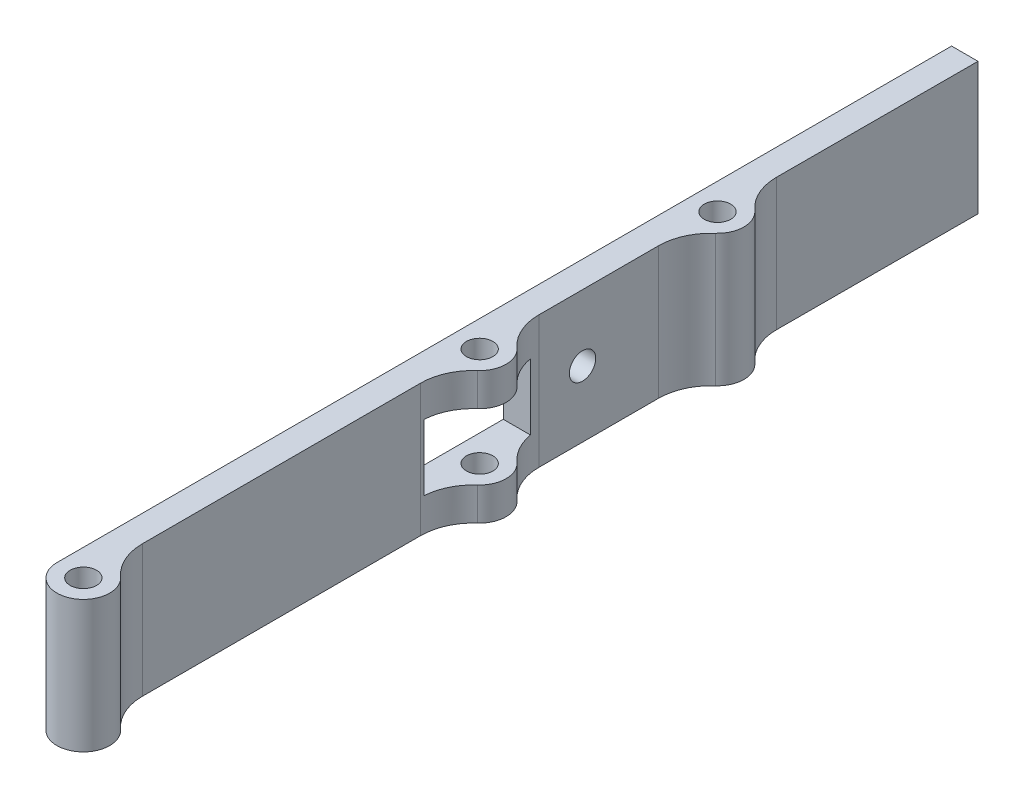
ISO-10303-21;
HEADER;
FILE_DESCRIPTION(('STEP AP214'),'2;1');
FILE_NAME('part.step','',(''),(''),'','','');
FILE_SCHEMA(('AUTOMOTIVE_DESIGN { 1 0 10303 214 1 1 1 1 }'));
ENDSEC;
DATA;
#1=APPLICATION_CONTEXT('core data for automotive mechanical design processes');
#2=APPLICATION_PROTOCOL_DEFINITION('international standard','automotive_design',2000,#1);
#3=PRODUCT_CONTEXT('',#1,'mechanical');
#4=PRODUCT('Part','Part','',(#3));
#5=PRODUCT_RELATED_PRODUCT_CATEGORY('part','',(#4));
#6=PRODUCT_DEFINITION_FORMATION('','',#4);
#7=PRODUCT_DEFINITION_CONTEXT('part definition',#1,'design');
#8=PRODUCT_DEFINITION('design','',#6,#7);
#9=PRODUCT_DEFINITION_SHAPE('','',#8);
#10=(LENGTH_UNIT() NAMED_UNIT(*) SI_UNIT(.MILLI.,.METRE.));
#11=(NAMED_UNIT(*) PLANE_ANGLE_UNIT() SI_UNIT($,.RADIAN.));
#12=(NAMED_UNIT(*) SI_UNIT($,.STERADIAN.) SOLID_ANGLE_UNIT());
#13=UNCERTAINTY_MEASURE_WITH_UNIT(LENGTH_MEASURE(1.E-05),#10,'distance_accuracy_value','');
#14=(GEOMETRIC_REPRESENTATION_CONTEXT(3) GLOBAL_UNCERTAINTY_ASSIGNED_CONTEXT((#13)) GLOBAL_UNIT_ASSIGNED_CONTEXT((#10,
#11,#12)) REPRESENTATION_CONTEXT('',''));
#15=CARTESIAN_POINT('',(0.,0.,0.));
#16=DIRECTION('',(0.,0.,1.));
#17=DIRECTION('',(1.,0.,0.));
#18=AXIS2_PLACEMENT_3D('',#15,#16,#17);
#19=CARTESIAN_POINT('',(5.03023790105675,25.,60.4524450067908));
#20=DIRECTION('',(0.,-1.,0.));
#21=DIRECTION('',(0.,0.,-1.));
#22=AXIS2_PLACEMENT_3D('',#19,#20,#21);
#23=CYLINDRICAL_SURFACE('',#22,5.);
#24=DIRECTION('',(0.,-1.,0.));
#25=VECTOR('',#24,1.);
#26=CARTESIAN_POINT('',(8.36357123439008,25.,56.7256650442912));
#27=LINE('',#26,#25);
#28=CARTESIAN_POINT('',(8.36357123439008,6.25,56.7256650442912));
#29=VERTEX_POINT('',#28);
#30=CARTESIAN_POINT('',(8.36357123439008,0.,56.7256650442912));
#31=VERTEX_POINT('',#30);
#32=EDGE_CURVE('E326',#29,#31,#27,.T.);
#33=ORIENTED_EDGE('',*,*,#32,.F.);
#34=CARTESIAN_POINT('',(5.03023790105675,6.25,60.4524450067908));
#35=DIRECTION('',(0.,-1.,0.));
#36=DIRECTION('',(0.,0.,-1.));
#37=AXIS2_PLACEMENT_3D('',#34,#35,#36);
#38=CIRCLE('',#37,5.);
#39=CARTESIAN_POINT('',(8.36357123439008,6.25,64.1792249692905));
#40=VERTEX_POINT('',#39);
#41=EDGE_CURVE('E206',#29,#40,#38,.T.);
#42=ORIENTED_EDGE('',*,*,#41,.T.);
#43=DIRECTION('',(0.,-1.,0.));
#44=VECTOR('',#43,1.);
#45=CARTESIAN_POINT('',(8.36357123439008,25.,64.1792249692905));
#46=LINE('',#45,#44);
#47=CARTESIAN_POINT('',(8.36357123439008,0.,64.1792249692905));
#48=VERTEX_POINT('',#47);
#49=EDGE_CURVE('E330',#40,#48,#46,.T.);
#50=ORIENTED_EDGE('',*,*,#49,.T.);
#51=CARTESIAN_POINT('',(5.03023790105675,0.,60.4524450067908));
#52=DIRECTION('',(0.,1.,0.));
#53=DIRECTION('',(0.,0.,1.));
#54=AXIS2_PLACEMENT_3D('',#51,#52,#53);
#55=CIRCLE('',#54,5.);
#56=EDGE_CURVE('E295',#48,#31,#55,.T.);
#57=ORIENTED_EDGE('',*,*,#56,.T.);
#58=EDGE_LOOP('',(#33,#42,#50,#57));
#59=FACE_BOUND('',#58,.T.);
#60=ADVANCED_FACE('F42',(#59),#23,.T.);
#61=CARTESIAN_POINT('',(5.03023790105675,25.,60.4524450067908));
#62=DIRECTION('',(0.,-1.,0.));
#63=DIRECTION('',(0.,0.,-1.));
#64=AXIS2_PLACEMENT_3D('',#61,#62,#63);
#65=CYLINDRICAL_SURFACE('',#64,2.5);
#66=CARTESIAN_POINT('',(5.03023790105675,18.75,60.4524450067908));
#67=DIRECTION('',(0.,1.,0.));
#68=DIRECTION('',(0.,0.,1.));
#69=AXIS2_PLACEMENT_3D('',#66,#67,#68);
#70=CIRCLE('',#69,2.5);
#71=CARTESIAN_POINT('',(5.03023790105675,18.75,62.9524450067908));
#72=VERTEX_POINT('',#71);
#73=EDGE_CURVE('E212',#72,#72,#70,.T.);
#74=ORIENTED_EDGE('',*,*,#73,.F.);
#75=EDGE_LOOP('',(#74));
#76=FACE_BOUND('',#75,.T.);
#77=CARTESIAN_POINT('',(5.03023790105675,25.,60.4524450067908));
#78=DIRECTION('',(0.,1.,0.));
#79=DIRECTION('',(0.,0.,1.));
#80=AXIS2_PLACEMENT_3D('',#77,#78,#79);
#81=CIRCLE('',#80,2.5);
#82=CARTESIAN_POINT('',(5.03023790105675,25.,62.9524450067908));
#83=VERTEX_POINT('',#82);
#84=EDGE_CURVE('E235',#83,#83,#81,.T.);
#85=ORIENTED_EDGE('',*,*,#84,.T.);
#86=EDGE_LOOP('',(#85));
#87=FACE_BOUND('',#86,.T.);
#88=ADVANCED_FACE('F439',(#76,#87),#65,.F.);
#89=CARTESIAN_POINT('',(14.9611491407969,25.,4.21069238771929));
#90=DIRECTION('',(0.,-1.,0.));
#91=DIRECTION('',(0.,0.,-1.));
#92=AXIS2_PLACEMENT_3D('',#89,#90,#91);
#93=PLANE('',#92);
#94=DIRECTION('',(-1.,0.,0.));
#95=VECTOR('',#94,1.);
#96=CARTESIAN_POINT('',(0.030237901056749,25.,-33.8475549932092));
#97=LINE('',#96,#95);
#98=CARTESIAN_POINT('',(5.03023790105675,25.,-33.8475549932092));
#99=VERTEX_POINT('',#98);
#100=CARTESIAN_POINT('',(0.030237901056749,25.,-33.8475549932092));
#101=VERTEX_POINT('',#100);
#102=EDGE_CURVE('E253',#99,#101,#97,.T.);
#103=ORIENTED_EDGE('',*,*,#102,.T.);
#104=DIRECTION('',(0.,0.,1.));
#105=VECTOR('',#104,1.);
#106=CARTESIAN_POINT('',(0.030237901056749,25.,-33.8475549932092));
#107=LINE('',#106,#105);
#108=CARTESIAN_POINT('',(0.030237901056749,25.,135.452445006791));
#109=VERTEX_POINT('',#108);
#110=EDGE_CURVE('E256',#101,#109,#107,.T.);
#111=ORIENTED_EDGE('',*,*,#110,.T.);
#112=CARTESIAN_POINT('',(5.03023790105675,25.,135.452445006791));
#113=DIRECTION('',(0.,1.,0.));
#114=DIRECTION('',(0.,0.,1.));
#115=AXIS2_PLACEMENT_3D('',#112,#113,#114);
#116=CIRCLE('',#115,5.);
#117=CARTESIAN_POINT('',(8.36357123439008,25.,131.725665044291));
#118=VERTEX_POINT('',#117);
#119=EDGE_CURVE('E259',#109,#118,#116,.T.);
#120=ORIENTED_EDGE('',*,*,#119,.T.);
#121=CARTESIAN_POINT('',(15.0302379010568,25.,124.272105119292));
#122=DIRECTION('',(0.,-1.,0.));
#123=DIRECTION('',(0.,0.,1.));
#124=AXIS2_PLACEMENT_3D('',#121,#122,#123);
#125=CIRCLE('',#124,10.);
#126=CARTESIAN_POINT('',(5.03023790105675,25.,124.272105119292));
#127=VERTEX_POINT('',#126);
#128=EDGE_CURVE('E261',#118,#127,#125,.T.);
#129=ORIENTED_EDGE('',*,*,#128,.T.);
#130=DIRECTION('',(0.,0.,-1.));
#131=VECTOR('',#130,1.);
#132=CARTESIAN_POINT('',(5.03023790105675,25.,71.6327848942898));
#133=LINE('',#132,#131);
#134=CARTESIAN_POINT('',(5.03023790105675,25.,71.6327848942898));
#135=VERTEX_POINT('',#134);
#136=EDGE_CURVE('E263',#127,#135,#133,.T.);
#137=ORIENTED_EDGE('',*,*,#136,.T.);
#138=CARTESIAN_POINT('',(15.0302379010567,25.,71.6327848942898));
#139=DIRECTION('',(0.,-1.,0.));
#140=DIRECTION('',(0.,0.,1.));
#141=AXIS2_PLACEMENT_3D('',#138,#139,#140);
#142=CIRCLE('',#141,10.);
#143=CARTESIAN_POINT('',(8.36357123439008,25.,64.1792249692905));
#144=VERTEX_POINT('',#143);
#145=EDGE_CURVE('E265',#135,#144,#142,.T.);
#146=ORIENTED_EDGE('',*,*,#145,.T.);
#147=CARTESIAN_POINT('',(5.03023790105675,25.,60.4524450067908));
#148=DIRECTION('',(0.,1.,0.));
#149=DIRECTION('',(0.,0.,1.));
#150=AXIS2_PLACEMENT_3D('',#147,#148,#149);
#151=CIRCLE('',#150,5.);
#152=CARTESIAN_POINT('',(8.36357123439008,25.,56.7256650442912));
#153=VERTEX_POINT('',#152);
#154=EDGE_CURVE('E267',#144,#153,#151,.T.);
#155=ORIENTED_EDGE('',*,*,#154,.T.);
#156=CARTESIAN_POINT('',(15.0302379010567,25.,49.2721051192919));
#157=DIRECTION('',(0.,-1.,0.));
#158=DIRECTION('',(0.,0.,-1.));
#159=AXIS2_PLACEMENT_3D('',#156,#157,#158);
#160=CIRCLE('',#159,10.);
#161=CARTESIAN_POINT('',(5.03023790105674,25.,49.2721051192919));
#162=VERTEX_POINT('',#161);
#163=EDGE_CURVE('E269',#153,#162,#160,.T.);
#164=ORIENTED_EDGE('',*,*,#163,.T.);
#165=DIRECTION('',(0.,0.,-1.));
#166=VECTOR('',#165,1.);
#167=CARTESIAN_POINT('',(5.03023790105674,25.,26.6327848942898));
#168=LINE('',#167,#166);
#169=CARTESIAN_POINT('',(5.03023790105674,25.,26.6327848942898));
#170=VERTEX_POINT('',#169);
#171=EDGE_CURVE('E271',#162,#170,#168,.T.);
#172=ORIENTED_EDGE('',*,*,#171,.T.);
#173=CARTESIAN_POINT('',(15.0302379010567,25.,26.6327848942898));
#174=DIRECTION('',(0.,-1.,0.));
#175=DIRECTION('',(0.,0.,-1.));
#176=AXIS2_PLACEMENT_3D('',#173,#174,#175);
#177=CIRCLE('',#176,10.);
#178=CARTESIAN_POINT('',(8.36357123439008,25.,19.1792249692905));
#179=VERTEX_POINT('',#178);
#180=EDGE_CURVE('E273',#170,#179,#177,.T.);
#181=ORIENTED_EDGE('',*,*,#180,.T.);
#182=CARTESIAN_POINT('',(5.03023790105675,25.,15.4524450067908));
#183=DIRECTION('',(0.,1.,0.));
#184=DIRECTION('',(0.,0.,-1.));
#185=AXIS2_PLACEMENT_3D('',#182,#183,#184);
#186=CIRCLE('',#185,5.);
#187=CARTESIAN_POINT('',(8.34054164763682,25.,11.705194133767));
#188=VERTEX_POINT('',#187);
#189=EDGE_CURVE('E275',#179,#188,#186,.T.);
#190=ORIENTED_EDGE('',*,*,#189,.T.);
#191=CARTESIAN_POINT('',(14.9611491407969,25.,4.21069238771929));
#192=DIRECTION('',(0.,-1.,0.));
#193=DIRECTION('',(0.,0.,-1.));
#194=AXIS2_PLACEMENT_3D('',#191,#192,#193);
#195=CIRCLE('',#194,10.);
#196=CARTESIAN_POINT('',(4.96116562596538,25.,4.19253465942388));
#197=VERTEX_POINT('',#196);
#198=EDGE_CURVE('E277',#188,#197,#195,.T.);
#199=ORIENTED_EDGE('',*,*,#198,.T.);
#200=DIRECTION('',(0.00181577282954107,0.,-0.999998351483157));
#201=VECTOR('',#200,1.);
#202=CARTESIAN_POINT('',(5.03023790105675,25.,-33.8475549932092));
#203=LINE('',#202,#201);
#204=EDGE_CURVE('E279',#197,#99,#203,.T.);
#205=ORIENTED_EDGE('',*,*,#204,.T.);
#206=EDGE_LOOP('',(#103,#111,#120,#129,#137,#146,#155,#164,#172,#181,#190,#199,#205));
#207=FACE_BOUND('',#206,.T.);
#208=CARTESIAN_POINT('',(5.03023790105675,25.,15.4524450067908));
#209=DIRECTION('',(0.,1.,0.));
#210=DIRECTION('',(0.,0.,1.));
#211=AXIS2_PLACEMENT_3D('',#208,#209,#210);
#212=CIRCLE('',#211,2.5);
#213=CARTESIAN_POINT('',(5.03023790105675,25.,17.9524450067908));
#214=VERTEX_POINT('',#213);
#215=EDGE_CURVE('E247',#214,#214,#212,.T.);
#216=ORIENTED_EDGE('',*,*,#215,.F.);
#217=EDGE_LOOP('',(#216));
#218=FACE_BOUND('',#217,.T.);
#219=CARTESIAN_POINT('',(5.03023790105675,25.,135.452445006791));
#220=DIRECTION('',(0.,1.,0.));
#221=DIRECTION('',(0.,0.,1.));
#222=AXIS2_PLACEMENT_3D('',#219,#220,#221);
#223=CIRCLE('',#222,2.5);
#224=CARTESIAN_POINT('',(5.03023790105675,25.,137.952445006791));
#225=VERTEX_POINT('',#224);
#226=EDGE_CURVE('E241',#225,#225,#223,.T.);
#227=ORIENTED_EDGE('',*,*,#226,.F.);
#228=EDGE_LOOP('',(#227));
#229=FACE_BOUND('',#228,.T.);
#230=ORIENTED_EDGE('',*,*,#84,.F.);
#231=EDGE_LOOP('',(#230));
#232=FACE_BOUND('',#231,.T.);
#233=ADVANCED_FACE('F399',(#207,#218,#229,#232),#93,.F.);
#234=CARTESIAN_POINT('',(14.9611491407969,0.,4.21069238771929));
#235=DIRECTION('',(0.,-1.,0.));
#236=DIRECTION('',(0.,0.,-1.));
#237=AXIS2_PLACEMENT_3D('',#234,#235,#236);
#238=PLANE('',#237);
#239=CARTESIAN_POINT('',(5.03023790105675,0.,135.452445006791));
#240=DIRECTION('',(0.,1.,0.));
#241=DIRECTION('',(0.,0.,1.));
#242=AXIS2_PLACEMENT_3D('',#239,#240,#241);
#243=CIRCLE('',#242,2.5);
#244=CARTESIAN_POINT('',(5.03023790105675,0.,137.952445006791));
#245=VERTEX_POINT('',#244);
#246=EDGE_CURVE('E238',#245,#245,#243,.T.);
#247=ORIENTED_EDGE('',*,*,#246,.T.);
#248=EDGE_LOOP('',(#247));
#249=FACE_BOUND('',#248,.T.);
#250=DIRECTION('',(-1.,0.,0.));
#251=VECTOR('',#250,1.);
#252=CARTESIAN_POINT('',(0.030237901056749,0.,-33.8475549932092));
#253=LINE('',#252,#251);
#254=CARTESIAN_POINT('',(5.03023790105675,0.,-33.8475549932092));
#255=VERTEX_POINT('',#254);
#256=CARTESIAN_POINT('',(0.030237901056749,0.,-33.8475549932092));
#257=VERTEX_POINT('',#256);
#258=EDGE_CURVE('E250',#255,#257,#253,.T.);
#259=ORIENTED_EDGE('',*,*,#258,.F.);
#260=DIRECTION('',(0.00181577282954107,0.,-0.999998351483157));
#261=VECTOR('',#260,1.);
#262=CARTESIAN_POINT('',(5.03023790105675,0.,-33.8475549932092));
#263=LINE('',#262,#261);
#264=CARTESIAN_POINT('',(4.96116562596538,0.,4.19253465942388));
#265=VERTEX_POINT('',#264);
#266=EDGE_CURVE('E257',#265,#255,#263,.T.);
#267=ORIENTED_EDGE('',*,*,#266,.F.);
#268=CARTESIAN_POINT('',(14.9611491407969,0.,4.21069238771929));
#269=DIRECTION('',(0.,-1.,0.));
#270=DIRECTION('',(0.,0.,-1.));
#271=AXIS2_PLACEMENT_3D('',#268,#269,#270);
#272=CIRCLE('',#271,10.);
#273=CARTESIAN_POINT('',(8.34054164763682,0.,11.705194133767));
#274=VERTEX_POINT('',#273);
#275=EDGE_CURVE('E306',#274,#265,#272,.T.);
#276=ORIENTED_EDGE('',*,*,#275,.F.);
#277=CARTESIAN_POINT('',(5.03023790105675,0.,15.4524450067908));
#278=DIRECTION('',(0.,1.,0.));
#279=DIRECTION('',(0.,0.,-1.));
#280=AXIS2_PLACEMENT_3D('',#277,#278,#279);
#281=CIRCLE('',#280,5.);
#282=CARTESIAN_POINT('',(8.36357123439008,0.,19.1792249692905));
#283=VERTEX_POINT('',#282);
#284=EDGE_CURVE('E304',#283,#274,#281,.T.);
#285=ORIENTED_EDGE('',*,*,#284,.F.);
#286=CARTESIAN_POINT('',(15.0302379010567,0.,26.6327848942898));
#287=DIRECTION('',(0.,-1.,0.));
#288=DIRECTION('',(0.,0.,-1.));
#289=AXIS2_PLACEMENT_3D('',#286,#287,#288);
#290=CIRCLE('',#289,10.);
#291=CARTESIAN_POINT('',(5.03023790105674,0.,26.6327848942898));
#292=VERTEX_POINT('',#291);
#293=EDGE_CURVE('E302',#292,#283,#290,.T.);
#294=ORIENTED_EDGE('',*,*,#293,.F.);
#295=DIRECTION('',(0.,0.,-1.));
#296=VECTOR('',#295,1.);
#297=CARTESIAN_POINT('',(5.03023790105674,0.,26.6327848942898));
#298=LINE('',#297,#296);
#299=CARTESIAN_POINT('',(5.03023790105674,0.,49.2721051192919));
#300=VERTEX_POINT('',#299);
#301=EDGE_CURVE('E300',#300,#292,#298,.T.);
#302=ORIENTED_EDGE('',*,*,#301,.F.);
#303=CARTESIAN_POINT('',(15.0302379010567,0.,49.2721051192919));
#304=DIRECTION('',(0.,-1.,0.));
#305=DIRECTION('',(0.,0.,-1.));
#306=AXIS2_PLACEMENT_3D('',#303,#304,#305);
#307=CIRCLE('',#306,10.);
#308=EDGE_CURVE('E298',#31,#300,#307,.T.);
#309=ORIENTED_EDGE('',*,*,#308,.F.);
#310=ORIENTED_EDGE('',*,*,#56,.F.);
#311=CARTESIAN_POINT('',(15.0302379010567,0.,71.6327848942898));
#312=DIRECTION('',(0.,-1.,0.));
#313=DIRECTION('',(0.,0.,1.));
#314=AXIS2_PLACEMENT_3D('',#311,#312,#313);
#315=CIRCLE('',#314,10.);
#316=CARTESIAN_POINT('',(5.03023790105675,0.,71.6327848942898));
#317=VERTEX_POINT('',#316);
#318=EDGE_CURVE('E292',#317,#48,#315,.T.);
#319=ORIENTED_EDGE('',*,*,#318,.F.);
#320=DIRECTION('',(0.,0.,-1.));
#321=VECTOR('',#320,1.);
#322=CARTESIAN_POINT('',(5.03023790105675,0.,71.6327848942898));
#323=LINE('',#322,#321);
#324=CARTESIAN_POINT('',(5.03023790105675,0.,124.272105119292));
#325=VERTEX_POINT('',#324);
#326=EDGE_CURVE('E290',#325,#317,#323,.T.);
#327=ORIENTED_EDGE('',*,*,#326,.F.);
#328=CARTESIAN_POINT('',(15.0302379010568,0.,124.272105119292));
#329=DIRECTION('',(0.,-1.,0.));
#330=DIRECTION('',(0.,0.,1.));
#331=AXIS2_PLACEMENT_3D('',#328,#329,#330);
#332=CIRCLE('',#331,10.);
#333=CARTESIAN_POINT('',(8.36357123439008,0.,131.725665044291));
#334=VERTEX_POINT('',#333);
#335=EDGE_CURVE('E288',#334,#325,#332,.T.);
#336=ORIENTED_EDGE('',*,*,#335,.F.);
#337=CARTESIAN_POINT('',(5.03023790105675,0.,135.452445006791));
#338=DIRECTION('',(0.,1.,0.));
#339=DIRECTION('',(0.,0.,1.));
#340=AXIS2_PLACEMENT_3D('',#337,#338,#339);
#341=CIRCLE('',#340,5.);
#342=CARTESIAN_POINT('',(0.030237901056749,0.,135.452445006791));
#343=VERTEX_POINT('',#342);
#344=EDGE_CURVE('E286',#343,#334,#341,.T.);
#345=ORIENTED_EDGE('',*,*,#344,.F.);
#346=DIRECTION('',(0.,0.,1.));
#347=VECTOR('',#346,1.);
#348=CARTESIAN_POINT('',(0.030237901056749,0.,-33.8475549932092));
#349=LINE('',#348,#347);
#350=EDGE_CURVE('E284',#257,#343,#349,.T.);
#351=ORIENTED_EDGE('',*,*,#350,.F.);
#352=EDGE_LOOP('',(#259,#267,#276,#285,#294,#302,#309,#310,#319,#327,#336,#345,#351));
#353=FACE_BOUND('',#352,.T.);
#354=CARTESIAN_POINT('',(5.03023790105675,0.,15.4524450067908));
#355=DIRECTION('',(0.,1.,0.));
#356=DIRECTION('',(0.,0.,1.));
#357=AXIS2_PLACEMENT_3D('',#354,#355,#356);
#358=CIRCLE('',#357,2.5);
#359=CARTESIAN_POINT('',(5.03023790105675,0.,17.9524450067908));
#360=VERTEX_POINT('',#359);
#361=EDGE_CURVE('E244',#360,#360,#358,.T.);
#362=ORIENTED_EDGE('',*,*,#361,.T.);
#363=EDGE_LOOP('',(#362));
#364=FACE_BOUND('',#363,.T.);
#365=CARTESIAN_POINT('',(5.03023790105675,0.,60.4524450067908));
#366=DIRECTION('',(0.,1.,0.));
#367=DIRECTION('',(0.,0.,1.));
#368=AXIS2_PLACEMENT_3D('',#365,#366,#367);
#369=CIRCLE('',#368,2.5);
#370=CARTESIAN_POINT('',(5.03023790105675,0.,62.9524450067908));
#371=VERTEX_POINT('',#370);
#372=EDGE_CURVE('E225',#371,#371,#369,.T.);
#373=ORIENTED_EDGE('',*,*,#372,.T.);
#374=EDGE_LOOP('',(#373));
#375=FACE_BOUND('',#374,.T.);
#376=ADVANCED_FACE('F385',(#249,#353,#364,#375),#238,.T.);
#377=CARTESIAN_POINT('',(0.030237901056749,25.,-33.8475549932092));
#378=DIRECTION('',(0.,0.,1.));
#379=DIRECTION('',(1.,0.,0.));
#380=AXIS2_PLACEMENT_3D('',#377,#378,#379);
#381=PLANE('',#380);
#382=CARTESIAN_POINT('',(2.5,15.,-33.8475549932092));
#383=DIRECTION('',(0.,0.,-1.));
#384=DIRECTION('',(-1.,0.,0.));
#385=AXIS2_PLACEMENT_3D('',#382,#383,#384);
#386=CIRCLE('',#385,0.999999999999999);
#387=CARTESIAN_POINT('',(1.5,15.,-33.8475549932092));
#388=VERTEX_POINT('',#387);
#389=EDGE_CURVE('E226',#388,#388,#386,.T.);
#390=ORIENTED_EDGE('',*,*,#389,.F.);
#391=EDGE_LOOP('',(#390));
#392=FACE_BOUND('',#391,.T.);
#393=CARTESIAN_POINT('',(2.5,5.,-33.8475549932092));
#394=DIRECTION('',(0.,0.,-1.));
#395=DIRECTION('',(-1.,0.,0.));
#396=AXIS2_PLACEMENT_3D('',#393,#394,#395);
#397=CIRCLE('',#396,1.);
#398=CARTESIAN_POINT('',(1.5,5.,-33.8475549932092));
#399=VERTEX_POINT('',#398);
#400=EDGE_CURVE('E229',#399,#399,#397,.T.);
#401=ORIENTED_EDGE('',*,*,#400,.F.);
#402=EDGE_LOOP('',(#401));
#403=FACE_BOUND('',#402,.T.);
#404=ORIENTED_EDGE('',*,*,#258,.T.);
#405=DIRECTION('',(0.,-1.,0.));
#406=VECTOR('',#405,1.);
#407=CARTESIAN_POINT('',(0.030237901056749,25.,-33.8475549932092));
#408=LINE('',#407,#406);
#409=EDGE_CURVE('E346',#101,#257,#408,.T.);
#410=ORIENTED_EDGE('',*,*,#409,.F.);
#411=ORIENTED_EDGE('',*,*,#102,.F.);
#412=DIRECTION('',(0.,-1.,0.));
#413=VECTOR('',#412,1.);
#414=CARTESIAN_POINT('',(5.03023790105675,25.,-33.8475549932092));
#415=LINE('',#414,#413);
#416=EDGE_CURVE('E281',#99,#255,#415,.T.);
#417=ORIENTED_EDGE('',*,*,#416,.T.);
#418=EDGE_LOOP('',(#404,#410,#411,#417));
#419=FACE_BOUND('',#418,.T.);
#420=ADVANCED_FACE('F44',(#392,#403,#419),#381,.F.);
#421=CARTESIAN_POINT('',(0.030237901056749,25.,-33.8475549932092));
#422=DIRECTION('',(1.,0.,0.));
#423=DIRECTION('',(0.,0.,-1.));
#424=AXIS2_PLACEMENT_3D('',#421,#422,#423);
#425=PLANE('',#424);
#426=DIRECTION('',(0.,-1.,0.));
#427=VECTOR('',#426,1.);
#428=CARTESIAN_POINT('',(0.030237901056749,6.25,50.9891099201272));
#429=LINE('',#428,#427);
#430=CARTESIAN_POINT('',(0.030237901056749,18.75,50.9891099201272));
#431=VERTEX_POINT('',#430);
#432=CARTESIAN_POINT('',(0.030237901056749,6.25,50.9891099201272));
#433=VERTEX_POINT('',#432);
#434=EDGE_CURVE('E185',#431,#433,#429,.T.);
#435=ORIENTED_EDGE('',*,*,#434,.F.);
#436=DIRECTION('',(0.,0.,-1.));
#437=VECTOR('',#436,1.);
#438=CARTESIAN_POINT('',(0.030237901056749,18.75,50.9891099201272));
#439=LINE('',#438,#437);
#440=CARTESIAN_POINT('',(0.030237901056749,18.75,70.9891099201272));
#441=VERTEX_POINT('',#440);
#442=EDGE_CURVE('E57',#441,#431,#439,.T.);
#443=ORIENTED_EDGE('',*,*,#442,.F.);
#444=DIRECTION('',(0.,1.,0.));
#445=VECTOR('',#444,1.);
#446=CARTESIAN_POINT('',(0.030237901056749,6.25,70.9891099201272));
#447=LINE('',#446,#445);
#448=CARTESIAN_POINT('',(0.030237901056749,6.25,70.9891099201272));
#449=VERTEX_POINT('',#448);
#450=EDGE_CURVE('E192',#449,#441,#447,.T.);
#451=ORIENTED_EDGE('',*,*,#450,.F.);
#452=DIRECTION('',(0.,0.,1.));
#453=VECTOR('',#452,1.);
#454=CARTESIAN_POINT('',(0.030237901056749,6.25,70.9891099201272));
#455=LINE('',#454,#453);
#456=EDGE_CURVE('E176',#433,#449,#455,.T.);
#457=ORIENTED_EDGE('',*,*,#456,.F.);
#458=EDGE_LOOP('',(#435,#443,#451,#457));
#459=FACE_BOUND('',#458,.T.);
#460=CARTESIAN_POINT('',(0.030237901056749,12.5,40.9891099201272));
#461=DIRECTION('',(-1.,0.,0.));
#462=DIRECTION('',(0.,0.,1.));
#463=AXIS2_PLACEMENT_3D('',#460,#461,#462);
#464=CIRCLE('',#463,2.5);
#465=CARTESIAN_POINT('',(0.030237901056749,12.5,43.4891099201272));
#466=VERTEX_POINT('',#465);
#467=EDGE_CURVE('E202',#466,#466,#464,.T.);
#468=ORIENTED_EDGE('',*,*,#467,.F.);
#469=EDGE_LOOP('',(#468));
#470=FACE_BOUND('',#469,.T.);
#471=ORIENTED_EDGE('',*,*,#350,.T.);
#472=DIRECTION('',(0.,-1.,0.));
#473=VECTOR('',#472,1.);
#474=CARTESIAN_POINT('',(0.030237901056749,25.,135.452445006791));
#475=LINE('',#474,#473);
#476=EDGE_CURVE('E343',#109,#343,#475,.T.);
#477=ORIENTED_EDGE('',*,*,#476,.F.);
#478=ORIENTED_EDGE('',*,*,#110,.F.);
#479=ORIENTED_EDGE('',*,*,#409,.T.);
#480=EDGE_LOOP('',(#471,#477,#478,#479));
#481=FACE_BOUND('',#480,.T.);
#482=ADVANCED_FACE('F189',(#459,#470,#481),#425,.F.);
#483=CARTESIAN_POINT('',(5.03023790105675,25.,135.452445006791));
#484=DIRECTION('',(0.,-1.,0.));
#485=DIRECTION('',(0.,0.,-1.));
#486=AXIS2_PLACEMENT_3D('',#483,#484,#485);
#487=CYLINDRICAL_SURFACE('',#486,5.);
#488=ORIENTED_EDGE('',*,*,#344,.T.);
#489=DIRECTION('',(0.,-1.,0.));
#490=VECTOR('',#489,1.);
#491=CARTESIAN_POINT('',(8.36357123439008,25.,131.725665044291));
#492=LINE('',#491,#490);
#493=EDGE_CURVE('E340',#118,#334,#492,.T.);
#494=ORIENTED_EDGE('',*,*,#493,.F.);
#495=ORIENTED_EDGE('',*,*,#119,.F.);
#496=ORIENTED_EDGE('',*,*,#476,.T.);
#497=EDGE_LOOP('',(#488,#494,#495,#496));
#498=FACE_BOUND('',#497,.T.);
#499=ADVANCED_FACE('F416',(#498),#487,.T.);
#500=CARTESIAN_POINT('',(15.0302379010568,25.,124.272105119292));
#501=DIRECTION('',(0.,-1.,0.));
#502=DIRECTION('',(0.,0.,-1.));
#503=AXIS2_PLACEMENT_3D('',#500,#501,#502);
#504=CYLINDRICAL_SURFACE('',#503,10.);
#505=ORIENTED_EDGE('',*,*,#335,.T.);
#506=DIRECTION('',(0.,-1.,0.));
#507=VECTOR('',#506,1.);
#508=CARTESIAN_POINT('',(5.03023790105675,25.,124.272105119292));
#509=LINE('',#508,#507);
#510=EDGE_CURVE('E337',#127,#325,#509,.T.);
#511=ORIENTED_EDGE('',*,*,#510,.F.);
#512=ORIENTED_EDGE('',*,*,#128,.F.);
#513=ORIENTED_EDGE('',*,*,#493,.T.);
#514=EDGE_LOOP('',(#505,#511,#512,#513));
#515=FACE_BOUND('',#514,.T.);
#516=ADVANCED_FACE('F412',(#515),#504,.F.);
#517=CARTESIAN_POINT('',(5.03023790105675,25.,71.6327848942898));
#518=DIRECTION('',(-1.,0.,0.));
#519=DIRECTION('',(0.,0.,1.));
#520=AXIS2_PLACEMENT_3D('',#517,#518,#519);
#521=PLANE('',#520);
#522=ORIENTED_EDGE('',*,*,#326,.T.);
#523=DIRECTION('',(0.,-1.,0.));
#524=VECTOR('',#523,1.);
#525=CARTESIAN_POINT('',(5.03023790105675,25.,71.6327848942898));
#526=LINE('',#525,#524);
#527=EDGE_CURVE('E334',#135,#317,#526,.T.);
#528=ORIENTED_EDGE('',*,*,#527,.F.);
#529=ORIENTED_EDGE('',*,*,#136,.F.);
#530=ORIENTED_EDGE('',*,*,#510,.T.);
#531=EDGE_LOOP('',(#522,#528,#529,#530));
#532=FACE_BOUND('',#531,.T.);
#533=ADVANCED_FACE('F407',(#532),#521,.F.);
#534=CARTESIAN_POINT('',(15.0302379010567,25.,71.6327848942898));
#535=DIRECTION('',(0.,-1.,0.));
#536=DIRECTION('',(0.,0.,-1.));
#537=AXIS2_PLACEMENT_3D('',#534,#535,#536);
#538=CYLINDRICAL_SURFACE('',#537,10.);
#539=DIRECTION('',(0.,-1.,0.));
#540=VECTOR('',#539,1.);
#541=CARTESIAN_POINT('',(5.05097527661215,25.,70.9891099201272));
#542=LINE('',#541,#540);
#543=CARTESIAN_POINT('',(5.05097527661215,6.25,70.9891099201272));
#544=VERTEX_POINT('',#543);
#545=CARTESIAN_POINT('',(5.05097527661215,18.75,70.9891099201272));
#546=VERTEX_POINT('',#545);
#547=EDGE_CURVE('E11',#544,#546,#542,.F.);
#548=ORIENTED_EDGE('',*,*,#547,.T.);
#549=CARTESIAN_POINT('',(15.0302379010567,18.75,71.6327848942898));
#550=DIRECTION('',(0.,1.,0.));
#551=DIRECTION('',(0.,0.,1.));
#552=AXIS2_PLACEMENT_3D('',#549,#550,#551);
#553=CIRCLE('',#552,10.);
#554=CARTESIAN_POINT('',(8.36357123439008,18.75,64.1792249692905));
#555=VERTEX_POINT('',#554);
#556=EDGE_CURVE('E218',#546,#555,#553,.F.);
#557=ORIENTED_EDGE('',*,*,#556,.T.);
#558=EDGE_CURVE('E331',#144,#555,#46,.T.);
#559=ORIENTED_EDGE('',*,*,#558,.F.);
#560=ORIENTED_EDGE('',*,*,#145,.F.);
#561=ORIENTED_EDGE('',*,*,#527,.T.);
#562=ORIENTED_EDGE('',*,*,#318,.T.);
#563=ORIENTED_EDGE('',*,*,#49,.F.);
#564=CARTESIAN_POINT('',(15.0302379010567,6.25,71.6327848942898));
#565=DIRECTION('',(0.,-1.,0.));
#566=DIRECTION('',(0.,0.,-1.));
#567=AXIS2_PLACEMENT_3D('',#564,#565,#566);
#568=CIRCLE('',#567,10.);
#569=EDGE_CURVE('E209',#40,#544,#568,.F.);
#570=ORIENTED_EDGE('',*,*,#569,.T.);
#571=EDGE_LOOP('',(#548,#557,#559,#560,#561,#562,#563,#570));
#572=FACE_BOUND('',#571,.T.);
#573=ADVANCED_FACE('F368',(#572),#538,.F.);
#574=CARTESIAN_POINT('',(5.03023790105675,18.75,60.4524450067908));
#575=DIRECTION('',(0.,1.,0.));
#576=DIRECTION('',(0.,0.,1.));
#577=AXIS2_PLACEMENT_3D('',#574,#575,#576);
#578=CIRCLE('',#577,5.);
#579=CARTESIAN_POINT('',(8.36357123439008,18.75,56.7256650442912));
#580=VERTEX_POINT('',#579);
#581=EDGE_CURVE('E216',#555,#580,#578,.T.);
#582=ORIENTED_EDGE('',*,*,#581,.T.);
#583=EDGE_CURVE('E327',#153,#580,#27,.T.);
#584=ORIENTED_EDGE('',*,*,#583,.F.);
#585=ORIENTED_EDGE('',*,*,#154,.F.);
#586=ORIENTED_EDGE('',*,*,#558,.T.);
#587=EDGE_LOOP('',(#582,#584,#585,#586));
#588=FACE_BOUND('',#587,.T.);
#589=ADVANCED_FACE('F364',(#588),#23,.T.);
#590=CARTESIAN_POINT('',(15.0302379010567,25.,49.2721051192919));
#591=DIRECTION('',(0.,-1.,0.));
#592=DIRECTION('',(0.,0.,-1.));
#593=AXIS2_PLACEMENT_3D('',#590,#591,#592);
#594=CYLINDRICAL_SURFACE('',#593,10.);
#595=ORIENTED_EDGE('',*,*,#583,.T.);
#596=CARTESIAN_POINT('',(15.0302379010567,18.75,49.2721051192919));
#597=DIRECTION('',(0.,1.,0.));
#598=DIRECTION('',(0.,0.,1.));
#599=AXIS2_PLACEMENT_3D('',#596,#597,#598);
#600=CIRCLE('',#599,10.);
#601=CARTESIAN_POINT('',(5.17874590674905,18.75,50.9891099201272));
#602=VERTEX_POINT('',#601);
#603=EDGE_CURVE('E213',#580,#602,#600,.F.);
#604=ORIENTED_EDGE('',*,*,#603,.T.);
#605=DIRECTION('',(0.,-1.,0.));
#606=VECTOR('',#605,1.);
#607=CARTESIAN_POINT('',(5.17874590674905,25.,50.9891099201272));
#608=LINE('',#607,#606);
#609=CARTESIAN_POINT('',(5.17874590674905,6.25,50.9891099201272));
#610=VERTEX_POINT('',#609);
#611=EDGE_CURVE('E50',#602,#610,#608,.T.);
#612=ORIENTED_EDGE('',*,*,#611,.T.);
#613=CARTESIAN_POINT('',(15.0302379010567,6.25,49.2721051192919));
#614=DIRECTION('',(0.,-1.,0.));
#615=DIRECTION('',(0.,0.,-1.));
#616=AXIS2_PLACEMENT_3D('',#613,#614,#615);
#617=CIRCLE('',#616,10.);
#618=EDGE_CURVE('E179',#610,#29,#617,.F.);
#619=ORIENTED_EDGE('',*,*,#618,.T.);
#620=ORIENTED_EDGE('',*,*,#32,.T.);
#621=ORIENTED_EDGE('',*,*,#308,.T.);
#622=DIRECTION('',(0.,-1.,0.));
#623=VECTOR('',#622,1.);
#624=CARTESIAN_POINT('',(5.03023790105674,25.,49.2721051192919));
#625=LINE('',#624,#623);
#626=EDGE_CURVE('E323',#162,#300,#625,.T.);
#627=ORIENTED_EDGE('',*,*,#626,.F.);
#628=ORIENTED_EDGE('',*,*,#163,.F.);
#629=EDGE_LOOP('',(#595,#604,#612,#619,#620,#621,#627,#628));
#630=FACE_BOUND('',#629,.T.);
#631=ADVANCED_FACE('F355',(#630),#594,.F.);
#632=CARTESIAN_POINT('',(5.03023790105674,25.,26.6327848942898));
#633=DIRECTION('',(-1.,0.,0.));
#634=DIRECTION('',(0.,0.,1.));
#635=AXIS2_PLACEMENT_3D('',#632,#633,#634);
#636=PLANE('',#635);
#637=CARTESIAN_POINT('',(5.03023790105674,12.5,40.9891099201272));
#638=DIRECTION('',(-1.,0.,0.));
#639=DIRECTION('',(0.,0.,1.));
#640=AXIS2_PLACEMENT_3D('',#637,#638,#639);
#641=CIRCLE('',#640,2.5);
#642=CARTESIAN_POINT('',(5.03023790105674,12.5,43.4891099201272));
#643=VERTEX_POINT('',#642);
#644=EDGE_CURVE('E221',#643,#643,#641,.T.);
#645=ORIENTED_EDGE('',*,*,#644,.T.);
#646=EDGE_LOOP('',(#645));
#647=FACE_BOUND('',#646,.T.);
#648=ORIENTED_EDGE('',*,*,#301,.T.);
#649=DIRECTION('',(0.,-1.,0.));
#650=VECTOR('',#649,1.);
#651=CARTESIAN_POINT('',(5.03023790105674,25.,26.6327848942898));
#652=LINE('',#651,#650);
#653=EDGE_CURVE('E320',#170,#292,#652,.T.);
#654=ORIENTED_EDGE('',*,*,#653,.F.);
#655=ORIENTED_EDGE('',*,*,#171,.F.);
#656=ORIENTED_EDGE('',*,*,#626,.T.);
#657=EDGE_LOOP('',(#648,#654,#655,#656));
#658=FACE_BOUND('',#657,.T.);
#659=ADVANCED_FACE('F381',(#647,#658),#636,.F.);
#660=CARTESIAN_POINT('',(15.0302379010567,25.,26.6327848942898));
#661=DIRECTION('',(0.,-1.,0.));
#662=DIRECTION('',(0.,0.,-1.));
#663=AXIS2_PLACEMENT_3D('',#660,#661,#662);
#664=CYLINDRICAL_SURFACE('',#663,10.);
#665=ORIENTED_EDGE('',*,*,#293,.T.);
#666=DIRECTION('',(0.,-1.,0.));
#667=VECTOR('',#666,1.);
#668=CARTESIAN_POINT('',(8.36357123439008,25.,19.1792249692905));
#669=LINE('',#668,#667);
#670=EDGE_CURVE('E317',#179,#283,#669,.T.);
#671=ORIENTED_EDGE('',*,*,#670,.F.);
#672=ORIENTED_EDGE('',*,*,#180,.F.);
#673=ORIENTED_EDGE('',*,*,#653,.T.);
#674=EDGE_LOOP('',(#665,#671,#672,#673));
#675=FACE_BOUND('',#674,.T.);
#676=ADVANCED_FACE('F391',(#675),#664,.F.);
#677=CARTESIAN_POINT('',(5.03023790105675,25.,15.4524450067908));
#678=DIRECTION('',(0.,-1.,0.));
#679=DIRECTION('',(0.,0.,-1.));
#680=AXIS2_PLACEMENT_3D('',#677,#678,#679);
#681=CYLINDRICAL_SURFACE('',#680,5.);
#682=ORIENTED_EDGE('',*,*,#284,.T.);
#683=DIRECTION('',(0.,-1.,0.));
#684=VECTOR('',#683,1.);
#685=CARTESIAN_POINT('',(8.34054164763682,25.,11.705194133767));
#686=LINE('',#685,#684);
#687=EDGE_CURVE('E314',#188,#274,#686,.T.);
#688=ORIENTED_EDGE('',*,*,#687,.F.);
#689=ORIENTED_EDGE('',*,*,#189,.F.);
#690=ORIENTED_EDGE('',*,*,#670,.T.);
#691=EDGE_LOOP('',(#682,#688,#689,#690));
#692=FACE_BOUND('',#691,.T.);
#693=ADVANCED_FACE('F395',(#692),#681,.T.);
#694=CARTESIAN_POINT('',(14.9611491407969,25.,4.21069238771929));
#695=DIRECTION('',(0.,-1.,0.));
#696=DIRECTION('',(0.,0.,-1.));
#697=AXIS2_PLACEMENT_3D('',#694,#695,#696);
#698=CYLINDRICAL_SURFACE('',#697,10.);
#699=ORIENTED_EDGE('',*,*,#275,.T.);
#700=DIRECTION('',(0.,-1.,0.));
#701=VECTOR('',#700,1.);
#702=CARTESIAN_POINT('',(4.96116562596538,25.,4.19253465942388));
#703=LINE('',#702,#701);
#704=EDGE_CURVE('E311',#197,#265,#703,.T.);
#705=ORIENTED_EDGE('',*,*,#704,.F.);
#706=ORIENTED_EDGE('',*,*,#198,.F.);
#707=ORIENTED_EDGE('',*,*,#687,.T.);
#708=EDGE_LOOP('',(#699,#705,#706,#707));
#709=FACE_BOUND('',#708,.T.);
#710=ADVANCED_FACE('F428',(#709),#698,.F.);
#711=CARTESIAN_POINT('',(5.03023790105675,25.,-33.8475549932092));
#712=DIRECTION('',(-0.999998351483157,0.,-0.00181577282954107));
#713=DIRECTION('',(-0.00181577282954107,0.,0.999998351483157));
#714=AXIS2_PLACEMENT_3D('',#711,#712,#713);
#715=PLANE('',#714);
#716=ORIENTED_EDGE('',*,*,#266,.T.);
#717=ORIENTED_EDGE('',*,*,#416,.F.);
#718=ORIENTED_EDGE('',*,*,#204,.F.);
#719=ORIENTED_EDGE('',*,*,#704,.T.);
#720=EDGE_LOOP('',(#716,#717,#718,#719));
#721=FACE_BOUND('',#720,.T.);
#722=ADVANCED_FACE('F426',(#721),#715,.F.);
#723=CARTESIAN_POINT('',(5.03023790105675,25.,15.4524450067908));
#724=DIRECTION('',(0.,-1.,0.));
#725=DIRECTION('',(0.,0.,-1.));
#726=AXIS2_PLACEMENT_3D('',#723,#724,#725);
#727=CYLINDRICAL_SURFACE('',#726,2.5);
#728=ORIENTED_EDGE('',*,*,#215,.T.);
#729=EDGE_LOOP('',(#728));
#730=FACE_BOUND('',#729,.T.);
#731=ORIENTED_EDGE('',*,*,#361,.F.);
#732=EDGE_LOOP('',(#731));
#733=FACE_BOUND('',#732,.T.);
#734=ADVANCED_FACE('F435',(#730,#733),#727,.F.);
#735=CARTESIAN_POINT('',(5.03023790105675,25.,135.452445006791));
#736=DIRECTION('',(0.,-1.,0.));
#737=DIRECTION('',(0.,0.,-1.));
#738=AXIS2_PLACEMENT_3D('',#735,#736,#737);
#739=CYLINDRICAL_SURFACE('',#738,2.5);
#740=ORIENTED_EDGE('',*,*,#226,.T.);
#741=EDGE_LOOP('',(#740));
#742=FACE_BOUND('',#741,.T.);
#743=ORIENTED_EDGE('',*,*,#246,.F.);
#744=EDGE_LOOP('',(#743));
#745=FACE_BOUND('',#744,.T.);
#746=ADVANCED_FACE('F488',(#742,#745),#739,.F.);
#747=CARTESIAN_POINT('',(5.03023790105675,6.25,60.4524450067908));
#748=DIRECTION('',(0.,-1.,0.));
#749=DIRECTION('',(0.,0.,-1.));
#750=AXIS2_PLACEMENT_3D('',#747,#748,#749);
#751=CIRCLE('',#750,2.5);
#752=CARTESIAN_POINT('',(5.03023790105675,6.25,57.9524450067908));
#753=VERTEX_POINT('',#752);
#754=EDGE_CURVE('E199',#753,#753,#751,.T.);
#755=ORIENTED_EDGE('',*,*,#754,.F.);
#756=EDGE_LOOP('',(#755));
#757=FACE_BOUND('',#756,.T.);
#758=ORIENTED_EDGE('',*,*,#372,.F.);
#759=EDGE_LOOP('',(#758));
#760=FACE_BOUND('',#759,.T.);
#761=ADVANCED_FACE('F446',(#757,#760),#65,.F.);
#762=CARTESIAN_POINT('',(2.5,5.,-8.84755499320918));
#763=DIRECTION('',(0.,0.,-1.));
#764=DIRECTION('',(-1.,0.,0.));
#765=AXIS2_PLACEMENT_3D('',#762,#763,#764);
#766=CYLINDRICAL_SURFACE('',#765,1.);
#767=CARTESIAN_POINT('',(2.5,5.,-8.84755499320918));
#768=DIRECTION('',(0.,0.,-1.));
#769=DIRECTION('',(-1.,0.,0.));
#770=AXIS2_PLACEMENT_3D('',#767,#768,#769);
#771=CIRCLE('',#770,1.);
#772=CARTESIAN_POINT('',(1.5,5.,-8.84755499320918));
#773=VERTEX_POINT('',#772);
#774=EDGE_CURVE('E232',#773,#773,#771,.T.);
#775=ORIENTED_EDGE('',*,*,#774,.F.);
#776=EDGE_LOOP('',(#775));
#777=FACE_BOUND('',#776,.T.);
#778=ORIENTED_EDGE('',*,*,#400,.T.);
#779=EDGE_LOOP('',(#778));
#780=FACE_BOUND('',#779,.T.);
#781=ADVANCED_FACE('F476',(#777,#780),#766,.F.);
#782=CARTESIAN_POINT('',(2.5,5.,-8.84755499320918));
#783=DIRECTION('',(0.,0.,-1.));
#784=DIRECTION('',(-1.,0.,0.));
#785=AXIS2_PLACEMENT_3D('',#782,#783,#784);
#786=PLANE('',#785);
#787=ORIENTED_EDGE('',*,*,#774,.T.);
#788=EDGE_LOOP('',(#787));
#789=FACE_BOUND('',#788,.T.);
#790=ADVANCED_FACE('F478',(#789),#786,.T.);
#791=CARTESIAN_POINT('',(2.5,15.,-8.84755499320918));
#792=DIRECTION('',(0.,0.,-1.));
#793=DIRECTION('',(-1.,0.,0.));
#794=AXIS2_PLACEMENT_3D('',#791,#792,#793);
#795=CYLINDRICAL_SURFACE('',#794,0.999999999999999);
#796=CARTESIAN_POINT('',(2.5,15.,-8.84755499320918));
#797=DIRECTION('',(0.,0.,-1.));
#798=DIRECTION('',(-1.,0.,0.));
#799=AXIS2_PLACEMENT_3D('',#796,#797,#798);
#800=CIRCLE('',#799,0.999999999999999);
#801=CARTESIAN_POINT('',(1.5,15.,-8.84755499320918));
#802=VERTEX_POINT('',#801);
#803=EDGE_CURVE('E222',#802,#802,#800,.T.);
#804=ORIENTED_EDGE('',*,*,#803,.F.);
#805=EDGE_LOOP('',(#804));
#806=FACE_BOUND('',#805,.T.);
#807=ORIENTED_EDGE('',*,*,#389,.T.);
#808=EDGE_LOOP('',(#807));
#809=FACE_BOUND('',#808,.T.);
#810=ADVANCED_FACE('F485',(#806,#809),#795,.F.);
#811=CARTESIAN_POINT('',(2.5,15.,-8.84755499320918));
#812=DIRECTION('',(0.,0.,-1.));
#813=DIRECTION('',(-1.,0.,0.));
#814=AXIS2_PLACEMENT_3D('',#811,#812,#813);
#815=PLANE('',#814);
#816=ORIENTED_EDGE('',*,*,#803,.T.);
#817=EDGE_LOOP('',(#816));
#818=FACE_BOUND('',#817,.T.);
#819=ADVANCED_FACE('F615',(#818),#815,.T.);
#820=CARTESIAN_POINT('',(10.0302379010568,6.25,70.9891099201272));
#821=DIRECTION('',(0.,0.,1.));
#822=DIRECTION('',(1.,0.,0.));
#823=AXIS2_PLACEMENT_3D('',#820,#821,#822);
#824=PLANE('',#823);
#825=DIRECTION('',(-1.,0.,0.));
#826=VECTOR('',#825,1.);
#827=CARTESIAN_POINT('',(10.0302379010568,6.25,70.9891099201272));
#828=LINE('',#827,#826);
#829=EDGE_CURVE('E181',#544,#449,#828,.T.);
#830=ORIENTED_EDGE('',*,*,#829,.T.);
#831=ORIENTED_EDGE('',*,*,#450,.T.);
#832=DIRECTION('',(-1.,0.,0.));
#833=VECTOR('',#832,1.);
#834=CARTESIAN_POINT('',(10.0302379010568,18.75,70.9891099201272));
#835=LINE('',#834,#833);
#836=EDGE_CURVE('E197',#546,#441,#835,.T.);
#837=ORIENTED_EDGE('',*,*,#836,.F.);
#838=ORIENTED_EDGE('',*,*,#547,.F.);
#839=EDGE_LOOP('',(#830,#831,#837,#838));
#840=FACE_BOUND('',#839,.T.);
#841=ADVANCED_FACE('F371',(#840),#824,.F.);
#842=CARTESIAN_POINT('',(10.0302379010568,6.25,50.9891099201272));
#843=DIRECTION('',(0.,0.,-1.));
#844=DIRECTION('',(-1.,0.,0.));
#845=AXIS2_PLACEMENT_3D('',#842,#843,#844);
#846=PLANE('',#845);
#847=DIRECTION('',(-1.,0.,0.));
#848=VECTOR('',#847,1.);
#849=CARTESIAN_POINT('',(10.0302379010568,18.75,50.9891099201272));
#850=LINE('',#849,#848);
#851=EDGE_CURVE('E182',#602,#431,#850,.T.);
#852=ORIENTED_EDGE('',*,*,#851,.T.);
#853=ORIENTED_EDGE('',*,*,#434,.T.);
#854=DIRECTION('',(-1.,0.,0.));
#855=VECTOR('',#854,1.);
#856=CARTESIAN_POINT('',(10.0302379010568,6.25,50.9891099201272));
#857=LINE('',#856,#855);
#858=EDGE_CURVE('E65',#610,#433,#857,.T.);
#859=ORIENTED_EDGE('',*,*,#858,.F.);
#860=ORIENTED_EDGE('',*,*,#611,.F.);
#861=EDGE_LOOP('',(#852,#853,#859,#860));
#862=FACE_BOUND('',#861,.T.);
#863=ADVANCED_FACE('F186',(#862),#846,.F.);
#864=CARTESIAN_POINT('',(10.0302379010568,18.75,50.9891099201272));
#865=DIRECTION('',(0.,1.,0.));
#866=DIRECTION('',(0.,0.,1.));
#867=AXIS2_PLACEMENT_3D('',#864,#865,#866);
#868=PLANE('',#867);
#869=ORIENTED_EDGE('',*,*,#73,.T.);
#870=EDGE_LOOP('',(#869));
#871=FACE_BOUND('',#870,.T.);
#872=ORIENTED_EDGE('',*,*,#836,.T.);
#873=ORIENTED_EDGE('',*,*,#442,.T.);
#874=ORIENTED_EDGE('',*,*,#851,.F.);
#875=ORIENTED_EDGE('',*,*,#603,.F.);
#876=ORIENTED_EDGE('',*,*,#581,.F.);
#877=ORIENTED_EDGE('',*,*,#556,.F.);
#878=EDGE_LOOP('',(#872,#873,#874,#875,#876,#877));
#879=FACE_BOUND('',#878,.T.);
#880=ADVANCED_FACE('F358',(#871,#879),#868,.F.);
#881=CARTESIAN_POINT('',(10.0302379010568,6.25,70.9891099201272));
#882=DIRECTION('',(0.,-1.,0.));
#883=DIRECTION('',(0.,0.,-1.));
#884=AXIS2_PLACEMENT_3D('',#881,#882,#883);
#885=PLANE('',#884);
#886=ORIENTED_EDGE('',*,*,#754,.T.);
#887=EDGE_LOOP('',(#886));
#888=FACE_BOUND('',#887,.T.);
#889=ORIENTED_EDGE('',*,*,#41,.F.);
#890=ORIENTED_EDGE('',*,*,#618,.F.);
#891=ORIENTED_EDGE('',*,*,#858,.T.);
#892=ORIENTED_EDGE('',*,*,#456,.T.);
#893=ORIENTED_EDGE('',*,*,#829,.F.);
#894=ORIENTED_EDGE('',*,*,#569,.F.);
#895=EDGE_LOOP('',(#889,#890,#891,#892,#893,#894));
#896=FACE_BOUND('',#895,.T.);
#897=ADVANCED_FACE('F173',(#888,#896),#885,.F.);
#898=CARTESIAN_POINT('',(10.0302379010568,12.5,40.9891099201272));
#899=DIRECTION('',(-1.,0.,0.));
#900=DIRECTION('',(0.,0.,1.));
#901=AXIS2_PLACEMENT_3D('',#898,#899,#900);
#902=CYLINDRICAL_SURFACE('',#901,2.5);
#903=ORIENTED_EDGE('',*,*,#467,.T.);
#904=EDGE_LOOP('',(#903));
#905=FACE_BOUND('',#904,.T.);
#906=ORIENTED_EDGE('',*,*,#644,.F.);
#907=EDGE_LOOP('',(#906));
#908=FACE_BOUND('',#907,.T.);
#909=ADVANCED_FACE('F720',(#905,#908),#902,.F.);
#910=CLOSED_SHELL('',(#60,#88,#233,#376,#420,#482,#499,#516,#533,#573,#589,#631,#659,#676,#693,
#710,#722,#734,#746,#761,#781,#790,#810,#819,#841,#863,#880,#897,#909));
#911=MANIFOLD_SOLID_BREP('B2',#910);
#912=ADVANCED_BREP_SHAPE_REPRESENTATION('',(#18,#911),#14);
#913=SHAPE_DEFINITION_REPRESENTATION(#9,#912);
ENDSEC;
END-ISO-10303-21;
